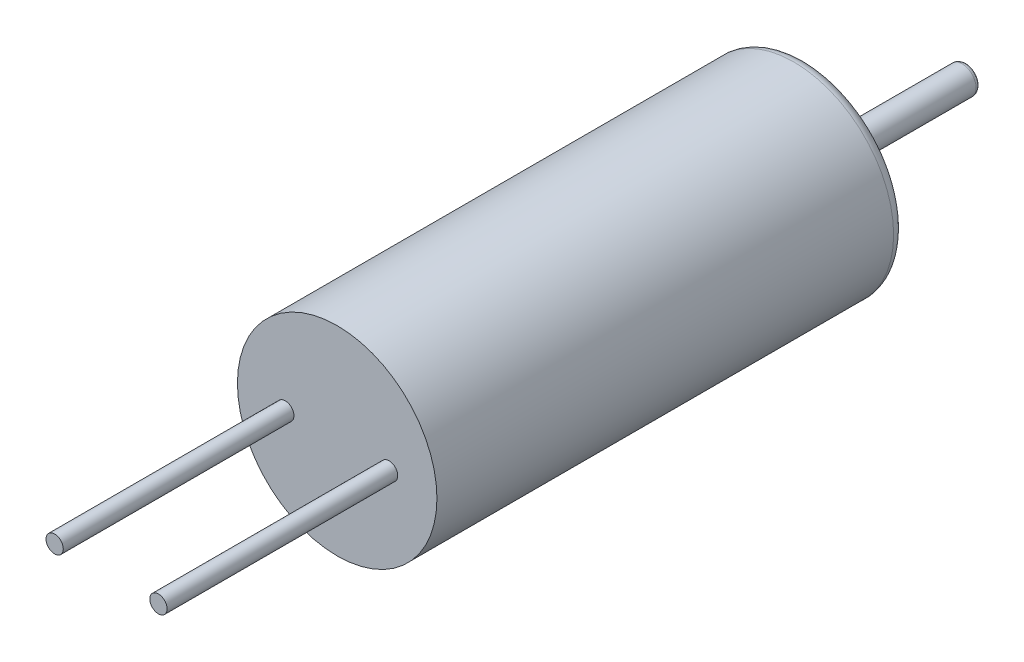
ISO-10303-21;
HEADER;
FILE_DESCRIPTION(('STEP AP214'),'2;1');
FILE_NAME('part.step','',(''),(''),'','','');
FILE_SCHEMA(('AUTOMOTIVE_DESIGN { 1 0 10303 214 1 1 1 1 }'));
ENDSEC;
DATA;
#1=APPLICATION_CONTEXT('core data for automotive mechanical design processes');
#2=APPLICATION_PROTOCOL_DEFINITION('international standard','automotive_design',2000,#1);
#3=PRODUCT_CONTEXT('',#1,'mechanical');
#4=PRODUCT('Part','Part','',(#3));
#5=PRODUCT_RELATED_PRODUCT_CATEGORY('part','',(#4));
#6=PRODUCT_DEFINITION_FORMATION('','',#4);
#7=PRODUCT_DEFINITION_CONTEXT('part definition',#1,'design');
#8=PRODUCT_DEFINITION('design','',#6,#7);
#9=PRODUCT_DEFINITION_SHAPE('','',#8);
#10=(LENGTH_UNIT() NAMED_UNIT(*) SI_UNIT(.MILLI.,.METRE.));
#11=(NAMED_UNIT(*) PLANE_ANGLE_UNIT() SI_UNIT($,.RADIAN.));
#12=(NAMED_UNIT(*) SI_UNIT($,.STERADIAN.) SOLID_ANGLE_UNIT());
#13=UNCERTAINTY_MEASURE_WITH_UNIT(LENGTH_MEASURE(1.E-05),#10,'distance_accuracy_value','');
#14=(GEOMETRIC_REPRESENTATION_CONTEXT(3) GLOBAL_UNCERTAINTY_ASSIGNED_CONTEXT((#13)) GLOBAL_UNIT_ASSIGNED_CONTEXT((#10,
#11,#12)) REPRESENTATION_CONTEXT('',''));
#15=CARTESIAN_POINT('',(0.,0.,0.));
#16=DIRECTION('',(0.,0.,1.));
#17=DIRECTION('',(1.,0.,0.));
#18=AXIS2_PLACEMENT_3D('',#15,#16,#17);
#19=CARTESIAN_POINT('',(1.2,0.,-20.3));
#20=DIRECTION('',(0.,0.,-1.));
#21=DIRECTION('',(-1.,0.,0.));
#22=AXIS2_PLACEMENT_3D('',#19,#20,#21);
#23=PLANE('',#22);
#24=CARTESIAN_POINT('',(0.,0.,-20.3));
#25=DIRECTION('',(0.,0.,-1.));
#26=DIRECTION('',(-1.,0.,0.));
#27=AXIS2_PLACEMENT_3D('',#24,#25,#26);
#28=CIRCLE('',#27,3.825);
#29=CARTESIAN_POINT('',(-3.825,0.,-20.3));
#30=VERTEX_POINT('',#29);
#31=EDGE_CURVE('E62',#30,#30,#28,.T.);
#32=ORIENTED_EDGE('',*,*,#31,.T.);
#33=EDGE_LOOP('',(#32));
#34=FACE_BOUND('',#33,.T.);
#35=CARTESIAN_POINT('',(0.,0.,-20.3));
#36=DIRECTION('',(0.,0.,1.));
#37=DIRECTION('',(1.,0.,0.));
#38=AXIS2_PLACEMENT_3D('',#35,#36,#37);
#39=CIRCLE('',#38,1.2);
#40=CARTESIAN_POINT('',(1.2,0.,-20.3));
#41=VERTEX_POINT('',#40);
#42=EDGE_CURVE('E74',#41,#41,#39,.T.);
#43=ORIENTED_EDGE('',*,*,#42,.T.);
#44=EDGE_LOOP('',(#43));
#45=FACE_BOUND('',#44,.T.);
#46=ADVANCED_FACE('F42',(#34,#45),#23,.T.);
#47=CARTESIAN_POINT('',(0.,0.,0.));
#48=DIRECTION('',(0.,0.,1.));
#49=DIRECTION('',(1.,0.,0.));
#50=AXIS2_PLACEMENT_3D('',#47,#48,#49);
#51=CYLINDRICAL_SURFACE('',#50,4.325);
#52=CARTESIAN_POINT('',(0.,0.,-19.8));
#53=DIRECTION('',(0.,0.,-1.));
#54=DIRECTION('',(-1.,0.,0.));
#55=AXIS2_PLACEMENT_3D('',#52,#53,#54);
#56=CIRCLE('',#55,4.325);
#57=CARTESIAN_POINT('',(-4.325,0.,-19.8));
#58=VERTEX_POINT('',#57);
#59=EDGE_CURVE('E65',#58,#58,#56,.F.);
#60=ORIENTED_EDGE('',*,*,#59,.T.);
#61=EDGE_LOOP('',(#60));
#62=FACE_BOUND('',#61,.T.);
#63=CARTESIAN_POINT('',(0.,0.,0.));
#64=DIRECTION('',(0.,0.,1.));
#65=DIRECTION('',(1.,0.,0.));
#66=AXIS2_PLACEMENT_3D('',#63,#64,#65);
#67=CIRCLE('',#66,4.325);
#68=CARTESIAN_POINT('',(4.325,0.,0.));
#69=VERTEX_POINT('',#68);
#70=EDGE_CURVE('E68',#69,#69,#67,.T.);
#71=ORIENTED_EDGE('',*,*,#70,.F.);
#72=EDGE_LOOP('',(#71));
#73=FACE_BOUND('',#72,.T.);
#74=ADVANCED_FACE('F103',(#62,#73),#51,.T.);
#75=CARTESIAN_POINT('',(4.325,0.,0.));
#76=DIRECTION('',(0.,0.,1.));
#77=DIRECTION('',(1.,0.,0.));
#78=AXIS2_PLACEMENT_3D('',#75,#76,#77);
#79=PLANE('',#78);
#80=CARTESIAN_POINT('',(-2.25,0.,0.));
#81=DIRECTION('',(0.,0.,1.));
#82=DIRECTION('',(1.,0.,0.));
#83=AXIS2_PLACEMENT_3D('',#80,#81,#82);
#84=CIRCLE('',#83,0.375);
#85=CARTESIAN_POINT('',(-1.875,0.,0.));
#86=VERTEX_POINT('',#85);
#87=EDGE_CURVE('E84',#86,#86,#84,.T.);
#88=ORIENTED_EDGE('',*,*,#87,.F.);
#89=EDGE_LOOP('',(#88));
#90=FACE_BOUND('',#89,.T.);
#91=CARTESIAN_POINT('',(2.25,0.,0.));
#92=DIRECTION('',(0.,0.,1.));
#93=DIRECTION('',(-1.,0.,0.));
#94=AXIS2_PLACEMENT_3D('',#91,#92,#93);
#95=CIRCLE('',#94,0.375);
#96=CARTESIAN_POINT('',(1.875,0.,0.));
#97=VERTEX_POINT('',#96);
#98=EDGE_CURVE('E81',#97,#97,#95,.T.);
#99=ORIENTED_EDGE('',*,*,#98,.F.);
#100=EDGE_LOOP('',(#99));
#101=FACE_BOUND('',#100,.T.);
#102=ORIENTED_EDGE('',*,*,#70,.T.);
#103=EDGE_LOOP('',(#102));
#104=FACE_BOUND('',#103,.T.);
#105=ADVANCED_FACE('F99',(#90,#101,#104),#79,.T.);
#106=CARTESIAN_POINT('',(0.,0.,-27.3));
#107=DIRECTION('',(0.,0.,-1.));
#108=DIRECTION('',(-1.,0.,0.));
#109=AXIS2_PLACEMENT_3D('',#106,#107,#108);
#110=PLANE('',#109);
#111=CARTESIAN_POINT('',(0.,0.,-27.3));
#112=DIRECTION('',(0.,0.,-1.));
#113=DIRECTION('',(-1.,0.,0.));
#114=AXIS2_PLACEMENT_3D('',#111,#112,#113);
#115=CIRCLE('',#114,0.400000000000002);
#116=CARTESIAN_POINT('',(-0.400000000000002,0.,-27.3));
#117=VERTEX_POINT('',#116);
#118=EDGE_CURVE('E53',#117,#117,#115,.T.);
#119=ORIENTED_EDGE('',*,*,#118,.T.);
#120=EDGE_LOOP('',(#119));
#121=FACE_BOUND('',#120,.T.);
#122=ADVANCED_FACE('F102',(#121),#110,.T.);
#123=CARTESIAN_POINT('',(0.,0.,0.));
#124=DIRECTION('',(0.,0.,1.));
#125=DIRECTION('',(1.,0.,0.));
#126=AXIS2_PLACEMENT_3D('',#123,#124,#125);
#127=CYLINDRICAL_SURFACE('',#126,0.600000000000002);
#128=CARTESIAN_POINT('',(0.,0.,-27.1));
#129=DIRECTION('',(0.,0.,-1.));
#130=DIRECTION('',(-1.,0.,0.));
#131=AXIS2_PLACEMENT_3D('',#128,#129,#130);
#132=CIRCLE('',#131,0.600000000000002);
#133=CARTESIAN_POINT('',(-0.600000000000002,0.,-27.1));
#134=VERTEX_POINT('',#133);
#135=EDGE_CURVE('E57',#134,#134,#132,.F.);
#136=ORIENTED_EDGE('',*,*,#135,.T.);
#137=EDGE_LOOP('',(#136));
#138=FACE_BOUND('',#137,.T.);
#139=CARTESIAN_POINT('',(0.,0.,-21.1));
#140=DIRECTION('',(0.,0.,1.));
#141=DIRECTION('',(1.,0.,0.));
#142=AXIS2_PLACEMENT_3D('',#139,#140,#141);
#143=CIRCLE('',#142,0.6);
#144=CARTESIAN_POINT('',(0.6,0.,-21.1));
#145=VERTEX_POINT('',#144);
#146=EDGE_CURVE('E71',#145,#145,#143,.T.);
#147=ORIENTED_EDGE('',*,*,#146,.F.);
#148=EDGE_LOOP('',(#147));
#149=FACE_BOUND('',#148,.T.);
#150=ADVANCED_FACE('F136',(#138,#149),#127,.T.);
#151=CARTESIAN_POINT('',(0.6,0.,-21.1));
#152=DIRECTION('',(0.,0.,-1.));
#153=DIRECTION('',(-1.,0.,0.));
#154=AXIS2_PLACEMENT_3D('',#151,#152,#153);
#155=PLANE('',#154);
#156=CARTESIAN_POINT('',(0.,0.,-21.1));
#157=DIRECTION('',(0.,0.,-1.));
#158=DIRECTION('',(-1.,0.,0.));
#159=AXIS2_PLACEMENT_3D('',#156,#157,#158);
#160=CIRCLE('',#159,1.);
#161=CARTESIAN_POINT('',(-1.,0.,-21.1));
#162=VERTEX_POINT('',#161);
#163=EDGE_CURVE('E10',#162,#162,#160,.T.);
#164=ORIENTED_EDGE('',*,*,#163,.T.);
#165=EDGE_LOOP('',(#164));
#166=FACE_BOUND('',#165,.T.);
#167=ORIENTED_EDGE('',*,*,#146,.T.);
#168=EDGE_LOOP('',(#167));
#169=FACE_BOUND('',#168,.T.);
#170=ADVANCED_FACE('F139',(#166,#169),#155,.T.);
#171=CARTESIAN_POINT('',(0.,0.,0.));
#172=DIRECTION('',(0.,0.,1.));
#173=DIRECTION('',(1.,0.,0.));
#174=AXIS2_PLACEMENT_3D('',#171,#172,#173);
#175=CYLINDRICAL_SURFACE('',#174,1.2);
#176=CARTESIAN_POINT('',(0.,0.,-20.9));
#177=DIRECTION('',(0.,0.,-1.));
#178=DIRECTION('',(-1.,0.,0.));
#179=AXIS2_PLACEMENT_3D('',#176,#177,#178);
#180=CIRCLE('',#179,1.2);
#181=CARTESIAN_POINT('',(-1.2,0.,-20.9));
#182=VERTEX_POINT('',#181);
#183=EDGE_CURVE('E49',#182,#182,#180,.F.);
#184=ORIENTED_EDGE('',*,*,#183,.T.);
#185=EDGE_LOOP('',(#184));
#186=FACE_BOUND('',#185,.T.);
#187=ORIENTED_EDGE('',*,*,#42,.F.);
#188=EDGE_LOOP('',(#187));
#189=FACE_BOUND('',#188,.T.);
#190=ADVANCED_FACE('F122',(#186,#189),#175,.T.);
#191=CARTESIAN_POINT('',(0.,0.,-19.8));
#192=DIRECTION('',(0.,0.,-1.));
#193=DIRECTION('',(-1.,0.,0.));
#194=AXIS2_PLACEMENT_3D('',#191,#192,#193);
#195=TOROIDAL_SURFACE('',#194,3.825,0.5);
#196=ORIENTED_EDGE('',*,*,#31,.F.);
#197=EDGE_LOOP('',(#196));
#198=FACE_BOUND('',#197,.T.);
#199=ORIENTED_EDGE('',*,*,#59,.F.);
#200=EDGE_LOOP('',(#199));
#201=FACE_BOUND('',#200,.T.);
#202=ADVANCED_FACE('F120',(#198,#201),#195,.T.);
#203=CARTESIAN_POINT('',(0.,0.,-27.1));
#204=DIRECTION('',(0.,0.,-1.));
#205=DIRECTION('',(-1.,0.,0.));
#206=AXIS2_PLACEMENT_3D('',#203,#204,#205);
#207=TOROIDAL_SURFACE('',#206,0.400000000000002,0.2);
#208=ORIENTED_EDGE('',*,*,#118,.F.);
#209=EDGE_LOOP('',(#208));
#210=FACE_BOUND('',#209,.T.);
#211=ORIENTED_EDGE('',*,*,#135,.F.);
#212=EDGE_LOOP('',(#211));
#213=FACE_BOUND('',#212,.T.);
#214=ADVANCED_FACE('F121',(#210,#213),#207,.T.);
#215=CARTESIAN_POINT('',(0.,0.,-20.9));
#216=DIRECTION('',(0.,0.,-1.));
#217=DIRECTION('',(-1.,0.,0.));
#218=AXIS2_PLACEMENT_3D('',#215,#216,#217);
#219=TOROIDAL_SURFACE('',#218,1.,0.2);
#220=ORIENTED_EDGE('',*,*,#163,.F.);
#221=EDGE_LOOP('',(#220));
#222=FACE_BOUND('',#221,.T.);
#223=ORIENTED_EDGE('',*,*,#183,.F.);
#224=EDGE_LOOP('',(#223));
#225=FACE_BOUND('',#224,.T.);
#226=ADVANCED_FACE('F44',(#222,#225),#219,.T.);
#227=CARTESIAN_POINT('',(2.25,0.,10.));
#228=DIRECTION('',(0.,0.,-1.));
#229=DIRECTION('',(-1.,0.,0.));
#230=AXIS2_PLACEMENT_3D('',#227,#228,#229);
#231=CYLINDRICAL_SURFACE('',#230,0.375);
#232=CARTESIAN_POINT('',(2.25,0.,10.));
#233=DIRECTION('',(0.,0.,1.));
#234=DIRECTION('',(-1.,0.,0.));
#235=AXIS2_PLACEMENT_3D('',#232,#233,#234);
#236=CIRCLE('',#235,0.375);
#237=CARTESIAN_POINT('',(1.875,0.,10.));
#238=VERTEX_POINT('',#237);
#239=EDGE_CURVE('E78',#238,#238,#236,.T.);
#240=ORIENTED_EDGE('',*,*,#239,.F.);
#241=EDGE_LOOP('',(#240));
#242=FACE_BOUND('',#241,.T.);
#243=ORIENTED_EDGE('',*,*,#98,.T.);
#244=EDGE_LOOP('',(#243));
#245=FACE_BOUND('',#244,.T.);
#246=ADVANCED_FACE('F130',(#242,#245),#231,.T.);
#247=CARTESIAN_POINT('',(2.25,0.,10.));
#248=DIRECTION('',(0.,0.,-1.));
#249=DIRECTION('',(-1.,0.,0.));
#250=AXIS2_PLACEMENT_3D('',#247,#248,#249);
#251=PLANE('',#250);
#252=ORIENTED_EDGE('',*,*,#239,.T.);
#253=EDGE_LOOP('',(#252));
#254=FACE_BOUND('',#253,.T.);
#255=ADVANCED_FACE('F95',(#254),#251,.F.);
#256=CARTESIAN_POINT('',(-2.25,0.,10.));
#257=DIRECTION('',(0.,0.,-1.));
#258=DIRECTION('',(-1.,0.,0.));
#259=AXIS2_PLACEMENT_3D('',#256,#257,#258);
#260=CYLINDRICAL_SURFACE('',#259,0.375);
#261=CARTESIAN_POINT('',(-2.25,0.,10.));
#262=DIRECTION('',(0.,0.,1.));
#263=DIRECTION('',(1.,0.,0.));
#264=AXIS2_PLACEMENT_3D('',#261,#262,#263);
#265=CIRCLE('',#264,0.375);
#266=CARTESIAN_POINT('',(-1.875,0.,10.));
#267=VERTEX_POINT('',#266);
#268=EDGE_CURVE('E77',#267,#267,#265,.T.);
#269=ORIENTED_EDGE('',*,*,#268,.F.);
#270=EDGE_LOOP('',(#269));
#271=FACE_BOUND('',#270,.T.);
#272=ORIENTED_EDGE('',*,*,#87,.T.);
#273=EDGE_LOOP('',(#272));
#274=FACE_BOUND('',#273,.T.);
#275=ADVANCED_FACE('F92',(#271,#274),#260,.T.);
#276=CARTESIAN_POINT('',(-2.25,0.,10.));
#277=DIRECTION('',(0.,0.,1.));
#278=DIRECTION('',(1.,0.,0.));
#279=AXIS2_PLACEMENT_3D('',#276,#277,#278);
#280=PLANE('',#279);
#281=ORIENTED_EDGE('',*,*,#268,.T.);
#282=EDGE_LOOP('',(#281));
#283=FACE_BOUND('',#282,.T.);
#284=ADVANCED_FACE('F90',(#283),#280,.T.);
#285=CLOSED_SHELL('',(#46,#74,#105,#122,#150,#170,#190,#202,#214,#226,#246,#255,#275,#284));
#286=MANIFOLD_SOLID_BREP('B2',#285);
#287=ADVANCED_BREP_SHAPE_REPRESENTATION('',(#18,#286),#14);
#288=SHAPE_DEFINITION_REPRESENTATION(#9,#287);
ENDSEC;
END-ISO-10303-21;
